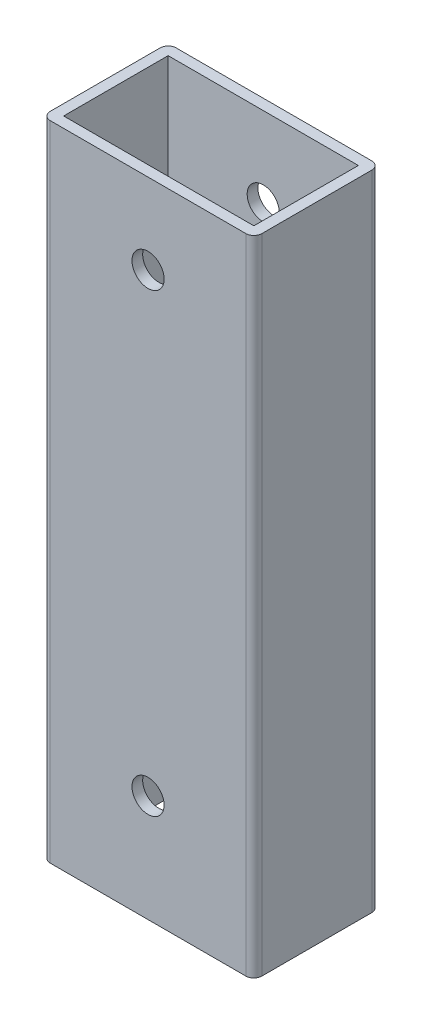
ISO-10303-21;
HEADER;
FILE_DESCRIPTION(('STEP AP214'),'2;1');
FILE_NAME('part.step','',(''),(''),'','','');
FILE_SCHEMA(('AUTOMOTIVE_DESIGN { 1 0 10303 214 1 1 1 1 }'));
ENDSEC;
DATA;
#1=APPLICATION_CONTEXT('core data for automotive mechanical design processes');
#2=APPLICATION_PROTOCOL_DEFINITION('international standard','automotive_design',2000,#1);
#3=PRODUCT_CONTEXT('',#1,'mechanical');
#4=PRODUCT('Part','Part','',(#3));
#5=PRODUCT_RELATED_PRODUCT_CATEGORY('part','',(#4));
#6=PRODUCT_DEFINITION_FORMATION('','',#4);
#7=PRODUCT_DEFINITION_CONTEXT('part definition',#1,'design');
#8=PRODUCT_DEFINITION('design','',#6,#7);
#9=PRODUCT_DEFINITION_SHAPE('','',#8);
#10=(LENGTH_UNIT() NAMED_UNIT(*) SI_UNIT(.MILLI.,.METRE.));
#11=(NAMED_UNIT(*) PLANE_ANGLE_UNIT() SI_UNIT($,.RADIAN.));
#12=(NAMED_UNIT(*) SI_UNIT($,.STERADIAN.) SOLID_ANGLE_UNIT());
#13=UNCERTAINTY_MEASURE_WITH_UNIT(LENGTH_MEASURE(1.E-05),#10,'distance_accuracy_value','');
#14=(GEOMETRIC_REPRESENTATION_CONTEXT(3) GLOBAL_UNCERTAINTY_ASSIGNED_CONTEXT((#13)) GLOBAL_UNIT_ASSIGNED_CONTEXT((#10,
#11,#12)) REPRESENTATION_CONTEXT('',''));
#15=CARTESIAN_POINT('',(0.,0.,0.));
#16=DIRECTION('',(0.,0.,1.));
#17=DIRECTION('',(1.,0.,0.));
#18=AXIS2_PLACEMENT_3D('',#15,#16,#17);
#19=CARTESIAN_POINT('',(0.,120.,0.));
#20=DIRECTION('',(0.,-1.,0.));
#21=DIRECTION('',(0.,0.,-1.));
#22=AXIS2_PLACEMENT_3D('',#19,#20,#21);
#23=PLANE('',#22);
#24=DIRECTION('',(1.,0.,0.));
#25=VECTOR('',#24,1.);
#26=CARTESIAN_POINT('',(-19.75,120.,11.75));
#27=LINE('',#26,#25);
#28=CARTESIAN_POINT('',(-18.25,120.,11.75));
#29=VERTEX_POINT('',#28);
#30=CARTESIAN_POINT('',(18.25,120.,11.75));
#31=VERTEX_POINT('',#30);
#32=EDGE_CURVE('E176',#29,#31,#27,.T.);
#33=ORIENTED_EDGE('',*,*,#32,.T.);
#34=CARTESIAN_POINT('',(18.25,120.,10.25));
#35=DIRECTION('',(0.,-1.,0.));
#36=DIRECTION('',(0.,0.,-1.));
#37=AXIS2_PLACEMENT_3D('',#34,#35,#36);
#38=CIRCLE('',#37,1.5);
#39=CARTESIAN_POINT('',(19.75,120.,10.25));
#40=VERTEX_POINT('',#39);
#41=EDGE_CURVE('E219',#31,#40,#38,.F.);
#42=ORIENTED_EDGE('',*,*,#41,.T.);
#43=DIRECTION('',(0.,0.,-1.));
#44=VECTOR('',#43,1.);
#45=CARTESIAN_POINT('',(19.75,120.,11.75));
#46=LINE('',#45,#44);
#47=CARTESIAN_POINT('',(19.75,120.,-10.25));
#48=VERTEX_POINT('',#47);
#49=EDGE_CURVE('E168',#40,#48,#46,.T.);
#50=ORIENTED_EDGE('',*,*,#49,.T.);
#51=CARTESIAN_POINT('',(18.25,120.,-10.25));
#52=DIRECTION('',(0.,-1.,0.));
#53=DIRECTION('',(0.,0.,-1.));
#54=AXIS2_PLACEMENT_3D('',#51,#52,#53);
#55=CIRCLE('',#54,1.5);
#56=CARTESIAN_POINT('',(18.25,120.,-11.75));
#57=VERTEX_POINT('',#56);
#58=EDGE_CURVE('E215',#48,#57,#55,.F.);
#59=ORIENTED_EDGE('',*,*,#58,.T.);
#60=DIRECTION('',(-1.,0.,0.));
#61=VECTOR('',#60,1.);
#62=CARTESIAN_POINT('',(-19.75,120.,-11.75));
#63=LINE('',#62,#61);
#64=CARTESIAN_POINT('',(-18.25,120.,-11.75));
#65=VERTEX_POINT('',#64);
#66=EDGE_CURVE('E171',#57,#65,#63,.T.);
#67=ORIENTED_EDGE('',*,*,#66,.T.);
#68=CARTESIAN_POINT('',(-18.25,120.,-10.25));
#69=DIRECTION('',(0.,-1.,0.));
#70=DIRECTION('',(0.,0.,-1.));
#71=AXIS2_PLACEMENT_3D('',#68,#69,#70);
#72=CIRCLE('',#71,1.5);
#73=CARTESIAN_POINT('',(-19.75,120.,-10.25));
#74=VERTEX_POINT('',#73);
#75=EDGE_CURVE('E55',#65,#74,#72,.F.);
#76=ORIENTED_EDGE('',*,*,#75,.T.);
#77=DIRECTION('',(0.,0.,1.));
#78=VECTOR('',#77,1.);
#79=CARTESIAN_POINT('',(-19.75,120.,11.75));
#80=LINE('',#79,#78);
#81=CARTESIAN_POINT('',(-19.75,120.,10.25));
#82=VERTEX_POINT('',#81);
#83=EDGE_CURVE('E174',#74,#82,#80,.T.);
#84=ORIENTED_EDGE('',*,*,#83,.T.);
#85=CARTESIAN_POINT('',(-18.25,120.,10.25));
#86=DIRECTION('',(0.,-1.,0.));
#87=DIRECTION('',(0.,0.,-1.));
#88=AXIS2_PLACEMENT_3D('',#85,#86,#87);
#89=CIRCLE('',#88,1.5);
#90=EDGE_CURVE('E217',#82,#29,#89,.F.);
#91=ORIENTED_EDGE('',*,*,#90,.T.);
#92=EDGE_LOOP('',(#33,#42,#50,#59,#67,#76,#84,#91));
#93=FACE_BOUND('',#92,.T.);
#94=DIRECTION('',(0.,0.,-1.));
#95=VECTOR('',#94,1.);
#96=CARTESIAN_POINT('',(17.75,120.,9.75));
#97=LINE('',#96,#95);
#98=CARTESIAN_POINT('',(17.75,120.,9.75));
#99=VERTEX_POINT('',#98);
#100=CARTESIAN_POINT('',(17.75,120.,-9.75));
#101=VERTEX_POINT('',#100);
#102=EDGE_CURVE('E125',#99,#101,#97,.T.);
#103=ORIENTED_EDGE('',*,*,#102,.F.);
#104=DIRECTION('',(1.,0.,0.));
#105=VECTOR('',#104,1.);
#106=CARTESIAN_POINT('',(-17.75,120.,9.75));
#107=LINE('',#106,#105);
#108=CARTESIAN_POINT('',(-17.75,120.,9.75));
#109=VERTEX_POINT('',#108);
#110=EDGE_CURVE('E150',#109,#99,#107,.T.);
#111=ORIENTED_EDGE('',*,*,#110,.F.);
#112=DIRECTION('',(0.,0.,1.));
#113=VECTOR('',#112,1.);
#114=CARTESIAN_POINT('',(-17.75,120.,9.75));
#115=LINE('',#114,#113);
#116=CARTESIAN_POINT('',(-17.75,120.,-9.75));
#117=VERTEX_POINT('',#116);
#118=EDGE_CURVE('E148',#117,#109,#115,.T.);
#119=ORIENTED_EDGE('',*,*,#118,.F.);
#120=DIRECTION('',(-1.,0.,0.));
#121=VECTOR('',#120,1.);
#122=CARTESIAN_POINT('',(-17.75,120.,-9.75));
#123=LINE('',#122,#121);
#124=EDGE_CURVE('E135',#101,#117,#123,.T.);
#125=ORIENTED_EDGE('',*,*,#124,.F.);
#126=EDGE_LOOP('',(#103,#111,#119,#125));
#127=FACE_BOUND('',#126,.T.);
#128=ADVANCED_FACE('F33',(#93,#127),#23,.F.);
#129=CARTESIAN_POINT('',(0.,0.,0.));
#130=DIRECTION('',(0.,-1.,0.));
#131=DIRECTION('',(0.,0.,-1.));
#132=AXIS2_PLACEMENT_3D('',#129,#130,#131);
#133=PLANE('',#132);
#134=DIRECTION('',(0.,0.,-1.));
#135=VECTOR('',#134,1.);
#136=CARTESIAN_POINT('',(19.75,0.,11.75));
#137=LINE('',#136,#135);
#138=CARTESIAN_POINT('',(19.75,0.,10.25));
#139=VERTEX_POINT('',#138);
#140=CARTESIAN_POINT('',(19.75,0.,-10.25));
#141=VERTEX_POINT('',#140);
#142=EDGE_CURVE('E143',#139,#141,#137,.T.);
#143=ORIENTED_EDGE('',*,*,#142,.F.);
#144=CARTESIAN_POINT('',(18.25,0.,10.25));
#145=DIRECTION('',(0.,-1.,0.));
#146=DIRECTION('',(0.,0.,-1.));
#147=AXIS2_PLACEMENT_3D('',#144,#145,#146);
#148=CIRCLE('',#147,1.5);
#149=CARTESIAN_POINT('',(18.25,0.,11.75));
#150=VERTEX_POINT('',#149);
#151=EDGE_CURVE('E207',#139,#150,#148,.T.);
#152=ORIENTED_EDGE('',*,*,#151,.T.);
#153=DIRECTION('',(1.,0.,0.));
#154=VECTOR('',#153,1.);
#155=CARTESIAN_POINT('',(-19.75,0.,11.75));
#156=LINE('',#155,#154);
#157=CARTESIAN_POINT('',(-18.25,0.,11.75));
#158=VERTEX_POINT('',#157);
#159=EDGE_CURVE('E172',#158,#150,#156,.T.);
#160=ORIENTED_EDGE('',*,*,#159,.F.);
#161=CARTESIAN_POINT('',(-18.25,0.,10.25));
#162=DIRECTION('',(0.,-1.,0.));
#163=DIRECTION('',(0.,0.,-1.));
#164=AXIS2_PLACEMENT_3D('',#161,#162,#163);
#165=CIRCLE('',#164,1.5);
#166=CARTESIAN_POINT('',(-19.75,0.,10.25));
#167=VERTEX_POINT('',#166);
#168=EDGE_CURVE('E205',#158,#167,#165,.T.);
#169=ORIENTED_EDGE('',*,*,#168,.T.);
#170=DIRECTION('',(0.,0.,1.));
#171=VECTOR('',#170,1.);
#172=CARTESIAN_POINT('',(-19.75,0.,11.75));
#173=LINE('',#172,#171);
#174=CARTESIAN_POINT('',(-19.75,0.,-10.25));
#175=VERTEX_POINT('',#174);
#176=EDGE_CURVE('E185',#175,#167,#173,.T.);
#177=ORIENTED_EDGE('',*,*,#176,.F.);
#178=CARTESIAN_POINT('',(-18.25,0.,-10.25));
#179=DIRECTION('',(0.,-1.,0.));
#180=DIRECTION('',(0.,0.,-1.));
#181=AXIS2_PLACEMENT_3D('',#178,#179,#180);
#182=CIRCLE('',#181,1.5);
#183=CARTESIAN_POINT('',(-18.25,0.,-11.75));
#184=VERTEX_POINT('',#183);
#185=EDGE_CURVE('E201',#175,#184,#182,.T.);
#186=ORIENTED_EDGE('',*,*,#185,.T.);
#187=DIRECTION('',(-1.,0.,0.));
#188=VECTOR('',#187,1.);
#189=CARTESIAN_POINT('',(-19.75,0.,-11.75));
#190=LINE('',#189,#188);
#191=CARTESIAN_POINT('',(18.25,0.,-11.75));
#192=VERTEX_POINT('',#191);
#193=EDGE_CURVE('E182',#192,#184,#190,.T.);
#194=ORIENTED_EDGE('',*,*,#193,.F.);
#195=CARTESIAN_POINT('',(18.25,0.,-10.25));
#196=DIRECTION('',(0.,-1.,0.));
#197=DIRECTION('',(0.,0.,-1.));
#198=AXIS2_PLACEMENT_3D('',#195,#196,#197);
#199=CIRCLE('',#198,1.5);
#200=EDGE_CURVE('E203',#192,#141,#199,.T.);
#201=ORIENTED_EDGE('',*,*,#200,.T.);
#202=EDGE_LOOP('',(#143,#152,#160,#169,#177,#186,#194,#201));
#203=FACE_BOUND('',#202,.T.);
#204=DIRECTION('',(1.,0.,0.));
#205=VECTOR('',#204,1.);
#206=CARTESIAN_POINT('',(-17.75,0.,9.75));
#207=LINE('',#206,#205);
#208=CARTESIAN_POINT('',(-17.75,0.,9.75));
#209=VERTEX_POINT('',#208);
#210=CARTESIAN_POINT('',(17.75,0.,9.75));
#211=VERTEX_POINT('',#210);
#212=EDGE_CURVE('E136',#209,#211,#207,.T.);
#213=ORIENTED_EDGE('',*,*,#212,.T.);
#214=DIRECTION('',(0.,0.,-1.));
#215=VECTOR('',#214,1.);
#216=CARTESIAN_POINT('',(17.75,0.,9.75));
#217=LINE('',#216,#215);
#218=CARTESIAN_POINT('',(17.75,0.,-9.75));
#219=VERTEX_POINT('',#218);
#220=EDGE_CURVE('E155',#211,#219,#217,.T.);
#221=ORIENTED_EDGE('',*,*,#220,.T.);
#222=DIRECTION('',(-1.,0.,0.));
#223=VECTOR('',#222,1.);
#224=CARTESIAN_POINT('',(-17.75,0.,-9.75));
#225=LINE('',#224,#223);
#226=CARTESIAN_POINT('',(-17.75,0.,-9.75));
#227=VERTEX_POINT('',#226);
#228=EDGE_CURVE('E142',#219,#227,#225,.T.);
#229=ORIENTED_EDGE('',*,*,#228,.T.);
#230=DIRECTION('',(0.,0.,1.));
#231=VECTOR('',#230,1.);
#232=CARTESIAN_POINT('',(-17.75,0.,9.75));
#233=LINE('',#232,#231);
#234=EDGE_CURVE('E159',#227,#209,#233,.T.);
#235=ORIENTED_EDGE('',*,*,#234,.T.);
#236=EDGE_LOOP('',(#213,#221,#229,#235));
#237=FACE_BOUND('',#236,.T.);
#238=ADVANCED_FACE('F237',(#203,#237),#133,.T.);
#239=CARTESIAN_POINT('',(19.75,120.,11.75));
#240=DIRECTION('',(-1.,0.,0.));
#241=DIRECTION('',(0.,0.,1.));
#242=AXIS2_PLACEMENT_3D('',#239,#240,#241);
#243=PLANE('',#242);
#244=ORIENTED_EDGE('',*,*,#49,.F.);
#245=DIRECTION('',(0.,-1.,0.));
#246=VECTOR('',#245,1.);
#247=CARTESIAN_POINT('',(19.75,120.,10.25));
#248=LINE('',#247,#246);
#249=EDGE_CURVE('E198',#40,#139,#248,.T.);
#250=ORIENTED_EDGE('',*,*,#249,.T.);
#251=ORIENTED_EDGE('',*,*,#142,.T.);
#252=DIRECTION('',(0.,-1.,0.));
#253=VECTOR('',#252,1.);
#254=CARTESIAN_POINT('',(19.75,120.,-10.25));
#255=LINE('',#254,#253);
#256=EDGE_CURVE('E179',#141,#48,#255,.F.);
#257=ORIENTED_EDGE('',*,*,#256,.T.);
#258=EDGE_LOOP('',(#244,#250,#251,#257));
#259=FACE_BOUND('',#258,.T.);
#260=ADVANCED_FACE('F254',(#259),#243,.F.);
#261=CARTESIAN_POINT('',(-19.75,120.,-11.75));
#262=DIRECTION('',(0.,0.,1.));
#263=DIRECTION('',(1.,0.,0.));
#264=AXIS2_PLACEMENT_3D('',#261,#262,#263);
#265=PLANE('',#264);
#266=CARTESIAN_POINT('',(0.,105.,-11.75));
#267=DIRECTION('',(0.,0.,-1.));
#268=DIRECTION('',(-1.,0.,0.));
#269=AXIS2_PLACEMENT_3D('',#266,#267,#268);
#270=CIRCLE('',#269,3.);
#271=CARTESIAN_POINT('',(-3.,105.,-11.75));
#272=VERTEX_POINT('',#271);
#273=EDGE_CURVE('E311',#272,#272,#270,.T.);
#274=ORIENTED_EDGE('',*,*,#273,.F.);
#275=EDGE_LOOP('',(#274));
#276=FACE_BOUND('',#275,.T.);
#277=CARTESIAN_POINT('',(0.,20.,-11.75));
#278=DIRECTION('',(0.,0.,-1.));
#279=DIRECTION('',(-1.,0.,0.));
#280=AXIS2_PLACEMENT_3D('',#277,#278,#279);
#281=CIRCLE('',#280,3.);
#282=CARTESIAN_POINT('',(-3.,20.,-11.75));
#283=VERTEX_POINT('',#282);
#284=EDGE_CURVE('E317',#283,#283,#281,.T.);
#285=ORIENTED_EDGE('',*,*,#284,.F.);
#286=EDGE_LOOP('',(#285));
#287=FACE_BOUND('',#286,.T.);
#288=ORIENTED_EDGE('',*,*,#66,.F.);
#289=DIRECTION('',(0.,-1.,0.));
#290=VECTOR('',#289,1.);
#291=CARTESIAN_POINT('',(18.25,120.,-11.75));
#292=LINE('',#291,#290);
#293=EDGE_CURVE('E11',#57,#192,#292,.T.);
#294=ORIENTED_EDGE('',*,*,#293,.T.);
#295=ORIENTED_EDGE('',*,*,#193,.T.);
#296=DIRECTION('',(0.,-1.,0.));
#297=VECTOR('',#296,1.);
#298=CARTESIAN_POINT('',(-18.25,120.,-11.75));
#299=LINE('',#298,#297);
#300=EDGE_CURVE('E41',#184,#65,#299,.F.);
#301=ORIENTED_EDGE('',*,*,#300,.T.);
#302=EDGE_LOOP('',(#288,#294,#295,#301));
#303=FACE_BOUND('',#302,.T.);
#304=ADVANCED_FACE('F227',(#276,#287,#303),#265,.F.);
#305=CARTESIAN_POINT('',(-19.75,120.,11.75));
#306=DIRECTION('',(1.,0.,0.));
#307=DIRECTION('',(0.,0.,-1.));
#308=AXIS2_PLACEMENT_3D('',#305,#306,#307);
#309=PLANE('',#308);
#310=ORIENTED_EDGE('',*,*,#176,.T.);
#311=DIRECTION('',(0.,-1.,0.));
#312=VECTOR('',#311,1.);
#313=CARTESIAN_POINT('',(-19.75,120.,10.25));
#314=LINE('',#313,#312);
#315=EDGE_CURVE('E48',#167,#82,#314,.F.);
#316=ORIENTED_EDGE('',*,*,#315,.T.);
#317=ORIENTED_EDGE('',*,*,#83,.F.);
#318=DIRECTION('',(0.,-1.,0.));
#319=VECTOR('',#318,1.);
#320=CARTESIAN_POINT('',(-19.75,120.,-10.25));
#321=LINE('',#320,#319);
#322=EDGE_CURVE('E221',#74,#175,#321,.T.);
#323=ORIENTED_EDGE('',*,*,#322,.T.);
#324=EDGE_LOOP('',(#310,#316,#317,#323));
#325=FACE_BOUND('',#324,.T.);
#326=ADVANCED_FACE('F234',(#325),#309,.F.);
#327=CARTESIAN_POINT('',(-19.75,120.,11.75));
#328=DIRECTION('',(0.,0.,-1.));
#329=DIRECTION('',(-1.,0.,0.));
#330=AXIS2_PLACEMENT_3D('',#327,#328,#329);
#331=PLANE('',#330);
#332=CARTESIAN_POINT('',(0.,105.,11.75));
#333=DIRECTION('',(0.,0.,-1.));
#334=DIRECTION('',(-1.,0.,0.));
#335=AXIS2_PLACEMENT_3D('',#332,#333,#334);
#336=CIRCLE('',#335,3.);
#337=CARTESIAN_POINT('',(-3.,105.,11.75));
#338=VERTEX_POINT('',#337);
#339=EDGE_CURVE('E193',#338,#338,#336,.T.);
#340=ORIENTED_EDGE('',*,*,#339,.T.);
#341=EDGE_LOOP('',(#340));
#342=FACE_BOUND('',#341,.T.);
#343=CARTESIAN_POINT('',(0.,20.,11.75));
#344=DIRECTION('',(0.,0.,-1.));
#345=DIRECTION('',(-1.,0.,0.));
#346=AXIS2_PLACEMENT_3D('',#343,#344,#345);
#347=CIRCLE('',#346,3.);
#348=CARTESIAN_POINT('',(-3.,20.,11.75));
#349=VERTEX_POINT('',#348);
#350=EDGE_CURVE('E314',#349,#349,#347,.T.);
#351=ORIENTED_EDGE('',*,*,#350,.T.);
#352=EDGE_LOOP('',(#351));
#353=FACE_BOUND('',#352,.T.);
#354=ORIENTED_EDGE('',*,*,#159,.T.);
#355=DIRECTION('',(0.,-1.,0.));
#356=VECTOR('',#355,1.);
#357=CARTESIAN_POINT('',(18.25,120.,11.75));
#358=LINE('',#357,#356);
#359=EDGE_CURVE('E212',#150,#31,#358,.F.);
#360=ORIENTED_EDGE('',*,*,#359,.T.);
#361=ORIENTED_EDGE('',*,*,#32,.F.);
#362=DIRECTION('',(0.,-1.,0.));
#363=VECTOR('',#362,1.);
#364=CARTESIAN_POINT('',(-18.25,120.,11.75));
#365=LINE('',#364,#363);
#366=EDGE_CURVE('E209',#29,#158,#365,.T.);
#367=ORIENTED_EDGE('',*,*,#366,.T.);
#368=EDGE_LOOP('',(#354,#360,#361,#367));
#369=FACE_BOUND('',#368,.T.);
#370=ADVANCED_FACE('F246',(#342,#353,#369),#331,.F.);
#371=CARTESIAN_POINT('',(17.75,120.,9.75));
#372=DIRECTION('',(-1.,0.,0.));
#373=DIRECTION('',(0.,0.,1.));
#374=AXIS2_PLACEMENT_3D('',#371,#372,#373);
#375=PLANE('',#374);
#376=ORIENTED_EDGE('',*,*,#220,.F.);
#377=DIRECTION('',(0.,-1.,0.));
#378=VECTOR('',#377,1.);
#379=CARTESIAN_POINT('',(17.75,120.,9.75));
#380=LINE('',#379,#378);
#381=EDGE_CURVE('E131',#99,#211,#380,.T.);
#382=ORIENTED_EDGE('',*,*,#381,.F.);
#383=ORIENTED_EDGE('',*,*,#102,.T.);
#384=DIRECTION('',(0.,-1.,0.));
#385=VECTOR('',#384,1.);
#386=CARTESIAN_POINT('',(17.75,120.,-9.75));
#387=LINE('',#386,#385);
#388=EDGE_CURVE('E128',#101,#219,#387,.T.);
#389=ORIENTED_EDGE('',*,*,#388,.T.);
#390=EDGE_LOOP('',(#376,#382,#383,#389));
#391=FACE_BOUND('',#390,.T.);
#392=ADVANCED_FACE('F127',(#391),#375,.T.);
#393=CARTESIAN_POINT('',(-17.75,120.,-9.75));
#394=DIRECTION('',(0.,0.,1.));
#395=DIRECTION('',(1.,0.,0.));
#396=AXIS2_PLACEMENT_3D('',#393,#394,#395);
#397=PLANE('',#396);
#398=CARTESIAN_POINT('',(0.,105.,-9.75));
#399=DIRECTION('',(0.,0.,1.));
#400=DIRECTION('',(1.,0.,0.));
#401=AXIS2_PLACEMENT_3D('',#398,#399,#400);
#402=CIRCLE('',#401,3.);
#403=CARTESIAN_POINT('',(3.,105.,-9.75));
#404=VERTEX_POINT('',#403);
#405=EDGE_CURVE('E157',#404,#404,#402,.T.);
#406=ORIENTED_EDGE('',*,*,#405,.F.);
#407=EDGE_LOOP('',(#406));
#408=FACE_BOUND('',#407,.T.);
#409=CARTESIAN_POINT('',(0.,20.,-9.75));
#410=DIRECTION('',(0.,0.,1.));
#411=DIRECTION('',(1.,0.,0.));
#412=AXIS2_PLACEMENT_3D('',#409,#410,#411);
#413=CIRCLE('',#412,3.);
#414=CARTESIAN_POINT('',(3.,20.,-9.75));
#415=VERTEX_POINT('',#414);
#416=EDGE_CURVE('E192',#415,#415,#413,.T.);
#417=ORIENTED_EDGE('',*,*,#416,.F.);
#418=EDGE_LOOP('',(#417));
#419=FACE_BOUND('',#418,.T.);
#420=ORIENTED_EDGE('',*,*,#228,.F.);
#421=ORIENTED_EDGE('',*,*,#388,.F.);
#422=ORIENTED_EDGE('',*,*,#124,.T.);
#423=DIRECTION('',(0.,-1.,0.));
#424=VECTOR('',#423,1.);
#425=CARTESIAN_POINT('',(-17.75,120.,-9.75));
#426=LINE('',#425,#424);
#427=EDGE_CURVE('E144',#117,#227,#426,.T.);
#428=ORIENTED_EDGE('',*,*,#427,.T.);
#429=EDGE_LOOP('',(#420,#421,#422,#428));
#430=FACE_BOUND('',#429,.T.);
#431=ADVANCED_FACE('F139',(#408,#419,#430),#397,.T.);
#432=CARTESIAN_POINT('',(-17.75,120.,9.75));
#433=DIRECTION('',(1.,0.,0.));
#434=DIRECTION('',(0.,0.,-1.));
#435=AXIS2_PLACEMENT_3D('',#432,#433,#434);
#436=PLANE('',#435);
#437=ORIENTED_EDGE('',*,*,#234,.F.);
#438=ORIENTED_EDGE('',*,*,#427,.F.);
#439=ORIENTED_EDGE('',*,*,#118,.T.);
#440=DIRECTION('',(0.,-1.,0.));
#441=VECTOR('',#440,1.);
#442=CARTESIAN_POINT('',(-17.75,120.,9.75));
#443=LINE('',#442,#441);
#444=EDGE_CURVE('E165',#109,#209,#443,.T.);
#445=ORIENTED_EDGE('',*,*,#444,.T.);
#446=EDGE_LOOP('',(#437,#438,#439,#445));
#447=FACE_BOUND('',#446,.T.);
#448=ADVANCED_FACE('F327',(#447),#436,.T.);
#449=CARTESIAN_POINT('',(-17.75,120.,9.75));
#450=DIRECTION('',(0.,0.,-1.));
#451=DIRECTION('',(-1.,0.,0.));
#452=AXIS2_PLACEMENT_3D('',#449,#450,#451);
#453=PLANE('',#452);
#454=CARTESIAN_POINT('',(0.,105.,9.75));
#455=DIRECTION('',(0.,0.,-1.));
#456=DIRECTION('',(-1.,0.,0.));
#457=AXIS2_PLACEMENT_3D('',#454,#455,#456);
#458=CIRCLE('',#457,3.);
#459=CARTESIAN_POINT('',(-3.,105.,9.75));
#460=VERTEX_POINT('',#459);
#461=EDGE_CURVE('E194',#460,#460,#458,.T.);
#462=ORIENTED_EDGE('',*,*,#461,.F.);
#463=EDGE_LOOP('',(#462));
#464=FACE_BOUND('',#463,.T.);
#465=CARTESIAN_POINT('',(0.,20.,9.75));
#466=DIRECTION('',(0.,0.,-1.));
#467=DIRECTION('',(-1.,0.,0.));
#468=AXIS2_PLACEMENT_3D('',#465,#466,#467);
#469=CIRCLE('',#468,3.);
#470=CARTESIAN_POINT('',(-3.,20.,9.75));
#471=VERTEX_POINT('',#470);
#472=EDGE_CURVE('E189',#471,#471,#469,.T.);
#473=ORIENTED_EDGE('',*,*,#472,.F.);
#474=EDGE_LOOP('',(#473));
#475=FACE_BOUND('',#474,.T.);
#476=ORIENTED_EDGE('',*,*,#212,.F.);
#477=ORIENTED_EDGE('',*,*,#444,.F.);
#478=ORIENTED_EDGE('',*,*,#110,.T.);
#479=ORIENTED_EDGE('',*,*,#381,.T.);
#480=EDGE_LOOP('',(#476,#477,#478,#479));
#481=FACE_BOUND('',#480,.T.);
#482=ADVANCED_FACE('F305',(#464,#475,#481),#453,.T.);
#483=CARTESIAN_POINT('',(0.,20.,11.75));
#484=DIRECTION('',(0.,0.,-1.));
#485=DIRECTION('',(-1.,0.,0.));
#486=AXIS2_PLACEMENT_3D('',#483,#484,#485);
#487=CYLINDRICAL_SURFACE('',#486,3.);
#488=ORIENTED_EDGE('',*,*,#472,.T.);
#489=EDGE_LOOP('',(#488));
#490=FACE_BOUND('',#489,.T.);
#491=ORIENTED_EDGE('',*,*,#350,.F.);
#492=EDGE_LOOP('',(#491));
#493=FACE_BOUND('',#492,.T.);
#494=ADVANCED_FACE('F297',(#490,#493),#487,.F.);
#495=CARTESIAN_POINT('',(0.,105.,11.75));
#496=DIRECTION('',(0.,0.,-1.));
#497=DIRECTION('',(-1.,0.,0.));
#498=AXIS2_PLACEMENT_3D('',#495,#496,#497);
#499=CYLINDRICAL_SURFACE('',#498,3.);
#500=ORIENTED_EDGE('',*,*,#461,.T.);
#501=EDGE_LOOP('',(#500));
#502=FACE_BOUND('',#501,.T.);
#503=ORIENTED_EDGE('',*,*,#339,.F.);
#504=EDGE_LOOP('',(#503));
#505=FACE_BOUND('',#504,.T.);
#506=ADVANCED_FACE('F291',(#502,#505),#499,.F.);
#507=ORIENTED_EDGE('',*,*,#416,.T.);
#508=EDGE_LOOP('',(#507));
#509=FACE_BOUND('',#508,.T.);
#510=ORIENTED_EDGE('',*,*,#284,.T.);
#511=EDGE_LOOP('',(#510));
#512=FACE_BOUND('',#511,.T.);
#513=ADVANCED_FACE('F288',(#509,#512),#487,.F.);
#514=ORIENTED_EDGE('',*,*,#405,.T.);
#515=EDGE_LOOP('',(#514));
#516=FACE_BOUND('',#515,.T.);
#517=ORIENTED_EDGE('',*,*,#273,.T.);
#518=EDGE_LOOP('',(#517));
#519=FACE_BOUND('',#518,.T.);
#520=ADVANCED_FACE('F284',(#516,#519),#499,.F.);
#521=CARTESIAN_POINT('',(18.25,120.,10.25));
#522=DIRECTION('',(0.,-1.,0.));
#523=DIRECTION('',(0.,0.,-1.));
#524=AXIS2_PLACEMENT_3D('',#521,#522,#523);
#525=CYLINDRICAL_SURFACE('',#524,1.5);
#526=ORIENTED_EDGE('',*,*,#41,.F.);
#527=ORIENTED_EDGE('',*,*,#359,.F.);
#528=ORIENTED_EDGE('',*,*,#151,.F.);
#529=ORIENTED_EDGE('',*,*,#249,.F.);
#530=EDGE_LOOP('',(#526,#527,#528,#529));
#531=FACE_BOUND('',#530,.T.);
#532=ADVANCED_FACE('F252',(#531),#525,.T.);
#533=CARTESIAN_POINT('',(-18.25,120.,10.25));
#534=DIRECTION('',(0.,-1.,0.));
#535=DIRECTION('',(0.,0.,-1.));
#536=AXIS2_PLACEMENT_3D('',#533,#534,#535);
#537=CYLINDRICAL_SURFACE('',#536,1.5);
#538=ORIENTED_EDGE('',*,*,#90,.F.);
#539=ORIENTED_EDGE('',*,*,#315,.F.);
#540=ORIENTED_EDGE('',*,*,#168,.F.);
#541=ORIENTED_EDGE('',*,*,#366,.F.);
#542=EDGE_LOOP('',(#538,#539,#540,#541));
#543=FACE_BOUND('',#542,.T.);
#544=ADVANCED_FACE('F243',(#543),#537,.T.);
#545=CARTESIAN_POINT('',(18.25,120.,-10.25));
#546=DIRECTION('',(0.,-1.,0.));
#547=DIRECTION('',(0.,0.,-1.));
#548=AXIS2_PLACEMENT_3D('',#545,#546,#547);
#549=CYLINDRICAL_SURFACE('',#548,1.5);
#550=ORIENTED_EDGE('',*,*,#58,.F.);
#551=ORIENTED_EDGE('',*,*,#256,.F.);
#552=ORIENTED_EDGE('',*,*,#200,.F.);
#553=ORIENTED_EDGE('',*,*,#293,.F.);
#554=EDGE_LOOP('',(#550,#551,#552,#553));
#555=FACE_BOUND('',#554,.T.);
#556=ADVANCED_FACE('F257',(#555),#549,.T.);
#557=CARTESIAN_POINT('',(-18.25,120.,-10.25));
#558=DIRECTION('',(0.,-1.,0.));
#559=DIRECTION('',(0.,0.,-1.));
#560=AXIS2_PLACEMENT_3D('',#557,#558,#559);
#561=CYLINDRICAL_SURFACE('',#560,1.5);
#562=ORIENTED_EDGE('',*,*,#75,.F.);
#563=ORIENTED_EDGE('',*,*,#300,.F.);
#564=ORIENTED_EDGE('',*,*,#185,.F.);
#565=ORIENTED_EDGE('',*,*,#322,.F.);
#566=EDGE_LOOP('',(#562,#563,#564,#565));
#567=FACE_BOUND('',#566,.T.);
#568=ADVANCED_FACE('F35',(#567),#561,.T.);
#569=CLOSED_SHELL('',(#128,#238,#260,#304,#326,#370,#392,#431,#448,#482,#494,#506,#513,#520,
#532,#544,#556,#568));
#570=MANIFOLD_SOLID_BREP('B2',#569);
#571=ADVANCED_BREP_SHAPE_REPRESENTATION('',(#18,#570),#14);
#572=SHAPE_DEFINITION_REPRESENTATION(#9,#571);
ENDSEC;
END-ISO-10303-21;
